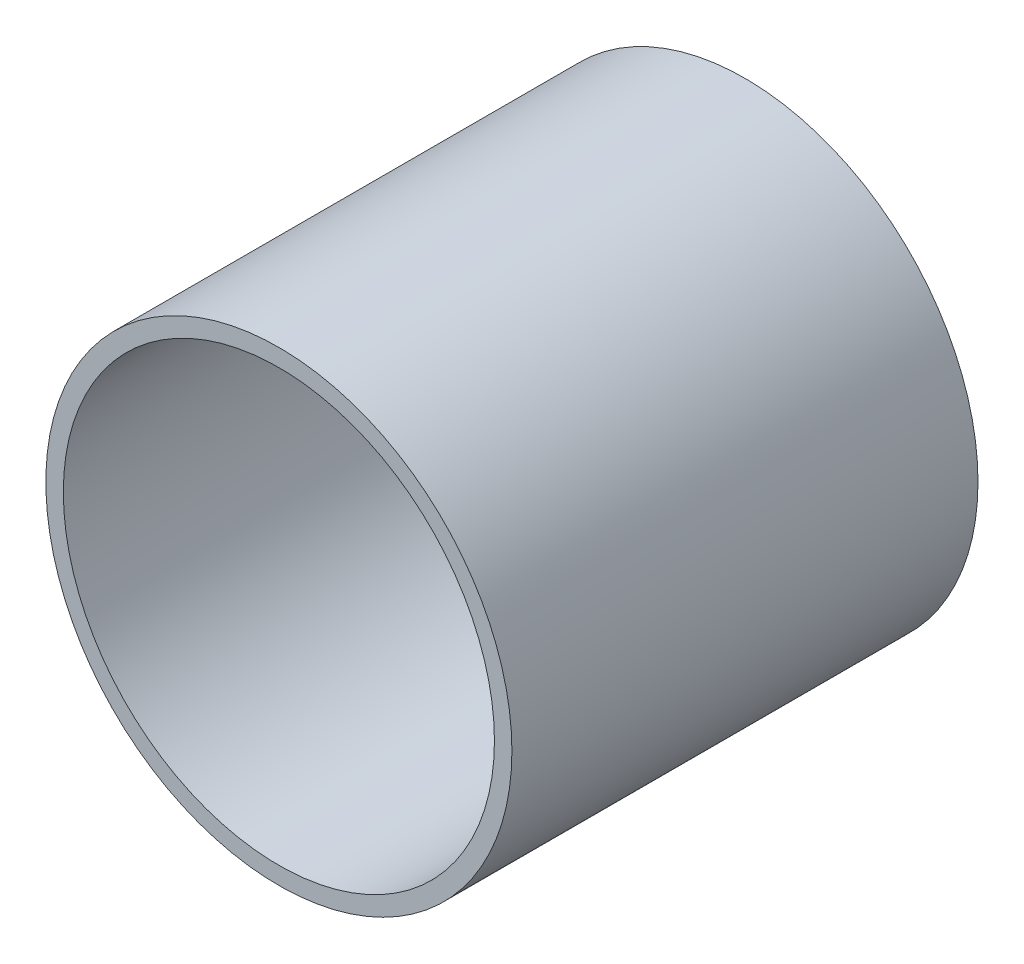
ISO-10303-21;
HEADER;
FILE_DESCRIPTION(('STEP AP214'),'2;1');
FILE_NAME('part.step','',(''),(''),'','','');
FILE_SCHEMA(('AUTOMOTIVE_DESIGN { 1 0 10303 214 1 1 1 1 }'));
ENDSEC;
DATA;
#1=APPLICATION_CONTEXT('core data for automotive mechanical design processes');
#2=APPLICATION_PROTOCOL_DEFINITION('international standard','automotive_design',2000,#1);
#3=PRODUCT_CONTEXT('',#1,'mechanical');
#4=PRODUCT('Part','Part','',(#3));
#5=PRODUCT_RELATED_PRODUCT_CATEGORY('part','',(#4));
#6=PRODUCT_DEFINITION_FORMATION('','',#4);
#7=PRODUCT_DEFINITION_CONTEXT('part definition',#1,'design');
#8=PRODUCT_DEFINITION('design','',#6,#7);
#9=PRODUCT_DEFINITION_SHAPE('','',#8);
#10=(LENGTH_UNIT() NAMED_UNIT(*) SI_UNIT(.MILLI.,.METRE.));
#11=(NAMED_UNIT(*) PLANE_ANGLE_UNIT() SI_UNIT($,.RADIAN.));
#12=(NAMED_UNIT(*) SI_UNIT($,.STERADIAN.) SOLID_ANGLE_UNIT());
#13=UNCERTAINTY_MEASURE_WITH_UNIT(LENGTH_MEASURE(1.E-05),#10,'distance_accuracy_value','');
#14=(GEOMETRIC_REPRESENTATION_CONTEXT(3) GLOBAL_UNCERTAINTY_ASSIGNED_CONTEXT((#13)) GLOBAL_UNIT_ASSIGNED_CONTEXT((#10,
#11,#12)) REPRESENTATION_CONTEXT('',''));
#15=CARTESIAN_POINT('',(0.,0.,0.));
#16=DIRECTION('',(0.,0.,1.));
#17=DIRECTION('',(1.,0.,0.));
#18=AXIS2_PLACEMENT_3D('',#15,#16,#17);
#19=CARTESIAN_POINT('',(0.,0.,20.));
#20=DIRECTION('',(0.,0.,1.));
#21=DIRECTION('',(1.,0.,0.));
#22=AXIS2_PLACEMENT_3D('',#19,#20,#21);
#23=PLANE('',#22);
#24=CARTESIAN_POINT('',(0.,0.,20.));
#25=DIRECTION('',(0.,0.,1.));
#26=DIRECTION('',(1.,0.,0.));
#27=AXIS2_PLACEMENT_3D('',#24,#25,#26);
#28=CIRCLE('',#27,20.);
#29=CARTESIAN_POINT('',(20.,0.,20.));
#30=VERTEX_POINT('',#29);
#31=EDGE_CURVE('E10',#30,#30,#28,.T.);
#32=ORIENTED_EDGE('',*,*,#31,.T.);
#33=EDGE_LOOP('',(#32));
#34=FACE_BOUND('',#33,.T.);
#35=CARTESIAN_POINT('',(0.,0.,20.));
#36=DIRECTION('',(0.,0.,1.));
#37=DIRECTION('',(1.,0.,0.));
#38=AXIS2_PLACEMENT_3D('',#35,#36,#37);
#39=CIRCLE('',#38,18.5);
#40=CARTESIAN_POINT('',(18.5,0.,20.));
#41=VERTEX_POINT('',#40);
#42=EDGE_CURVE('E44',#41,#41,#39,.T.);
#43=ORIENTED_EDGE('',*,*,#42,.F.);
#44=EDGE_LOOP('',(#43));
#45=FACE_BOUND('',#44,.T.);
#46=ADVANCED_FACE('F33',(#34,#45),#23,.T.);
#47=CARTESIAN_POINT('',(0.,0.,-20.));
#48=DIRECTION('',(0.,0.,1.));
#49=DIRECTION('',(1.,0.,0.));
#50=AXIS2_PLACEMENT_3D('',#47,#48,#49);
#51=PLANE('',#50);
#52=CARTESIAN_POINT('',(0.,0.,-20.));
#53=DIRECTION('',(0.,0.,1.));
#54=DIRECTION('',(1.,0.,0.));
#55=AXIS2_PLACEMENT_3D('',#52,#53,#54);
#56=CIRCLE('',#55,20.);
#57=CARTESIAN_POINT('',(20.,0.,-20.));
#58=VERTEX_POINT('',#57);
#59=EDGE_CURVE('E37',#58,#58,#56,.T.);
#60=ORIENTED_EDGE('',*,*,#59,.F.);
#61=EDGE_LOOP('',(#60));
#62=FACE_BOUND('',#61,.T.);
#63=CARTESIAN_POINT('',(0.,0.,-20.));
#64=DIRECTION('',(0.,0.,1.));
#65=DIRECTION('',(1.,0.,0.));
#66=AXIS2_PLACEMENT_3D('',#63,#64,#65);
#67=CIRCLE('',#66,18.5);
#68=CARTESIAN_POINT('',(18.5,0.,-20.));
#69=VERTEX_POINT('',#68);
#70=EDGE_CURVE('E46',#69,#69,#67,.T.);
#71=ORIENTED_EDGE('',*,*,#70,.T.);
#72=EDGE_LOOP('',(#71));
#73=FACE_BOUND('',#72,.T.);
#74=ADVANCED_FACE('F56',(#62,#73),#51,.F.);
#75=CARTESIAN_POINT('',(0.,0.,20.));
#76=DIRECTION('',(0.,0.,-1.));
#77=DIRECTION('',(-1.,0.,0.));
#78=AXIS2_PLACEMENT_3D('',#75,#76,#77);
#79=CYLINDRICAL_SURFACE('',#78,20.);
#80=ORIENTED_EDGE('',*,*,#31,.F.);
#81=EDGE_LOOP('',(#80));
#82=FACE_BOUND('',#81,.T.);
#83=ORIENTED_EDGE('',*,*,#59,.T.);
#84=EDGE_LOOP('',(#83));
#85=FACE_BOUND('',#84,.T.);
#86=ADVANCED_FACE('F35',(#82,#85),#79,.T.);
#87=CARTESIAN_POINT('',(0.,0.,20.));
#88=DIRECTION('',(0.,0.,-1.));
#89=DIRECTION('',(-1.,0.,0.));
#90=AXIS2_PLACEMENT_3D('',#87,#88,#89);
#91=CYLINDRICAL_SURFACE('',#90,18.5);
#92=ORIENTED_EDGE('',*,*,#42,.T.);
#93=EDGE_LOOP('',(#92));
#94=FACE_BOUND('',#93,.T.);
#95=ORIENTED_EDGE('',*,*,#70,.F.);
#96=EDGE_LOOP('',(#95));
#97=FACE_BOUND('',#96,.T.);
#98=ADVANCED_FACE('F52',(#94,#97),#91,.F.);
#99=CLOSED_SHELL('',(#46,#74,#86,#98));
#100=MANIFOLD_SOLID_BREP('B2',#99);
#101=ADVANCED_BREP_SHAPE_REPRESENTATION('',(#18,#100),#14);
#102=SHAPE_DEFINITION_REPRESENTATION(#9,#101);
ENDSEC;
END-ISO-10303-21;
